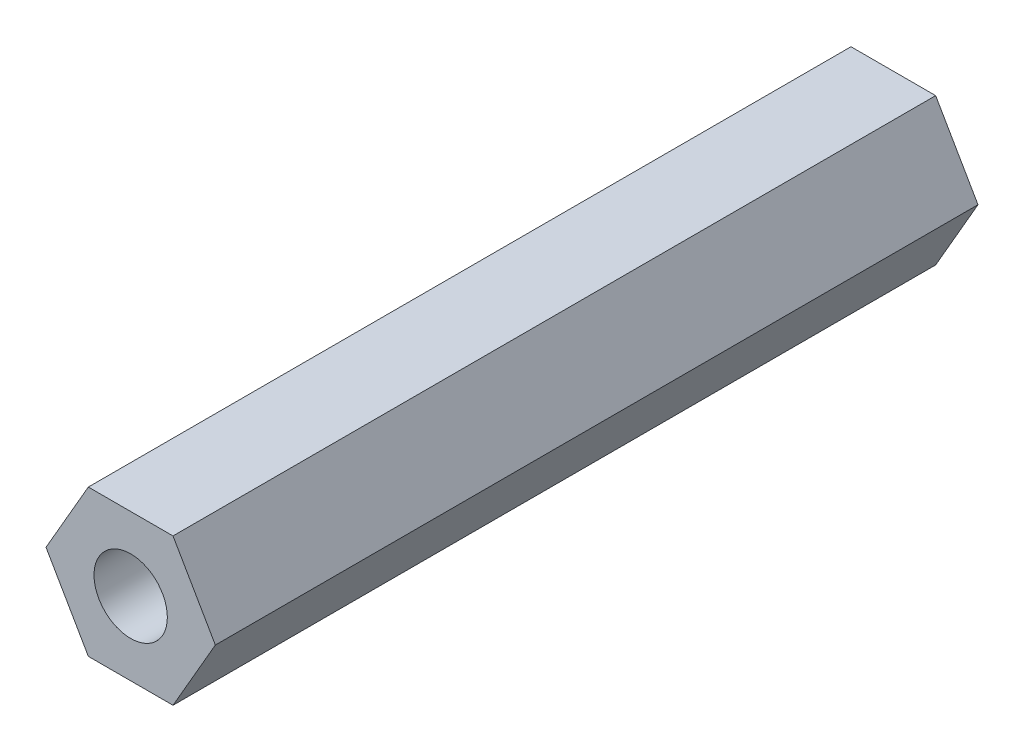
ISO-10303-21;
HEADER;
FILE_DESCRIPTION(('STEP AP214'),'2;1');
FILE_NAME('part.step','',(''),(''),'','','');
FILE_SCHEMA(('AUTOMOTIVE_DESIGN { 1 0 10303 214 1 1 1 1 }'));
ENDSEC;
DATA;
#1=APPLICATION_CONTEXT('core data for automotive mechanical design processes');
#2=APPLICATION_PROTOCOL_DEFINITION('international standard','automotive_design',2000,#1);
#3=PRODUCT_CONTEXT('',#1,'mechanical');
#4=PRODUCT('Part','Part','',(#3));
#5=PRODUCT_RELATED_PRODUCT_CATEGORY('part','',(#4));
#6=PRODUCT_DEFINITION_FORMATION('','',#4);
#7=PRODUCT_DEFINITION_CONTEXT('part definition',#1,'design');
#8=PRODUCT_DEFINITION('design','',#6,#7);
#9=PRODUCT_DEFINITION_SHAPE('','',#8);
#10=(LENGTH_UNIT() NAMED_UNIT(*) SI_UNIT(.MILLI.,.METRE.));
#11=(NAMED_UNIT(*) PLANE_ANGLE_UNIT() SI_UNIT($,.RADIAN.));
#12=(NAMED_UNIT(*) SI_UNIT($,.STERADIAN.) SOLID_ANGLE_UNIT());
#13=UNCERTAINTY_MEASURE_WITH_UNIT(LENGTH_MEASURE(1.E-05),#10,'distance_accuracy_value','');
#14=(GEOMETRIC_REPRESENTATION_CONTEXT(3) GLOBAL_UNCERTAINTY_ASSIGNED_CONTEXT((#13)) GLOBAL_UNIT_ASSIGNED_CONTEXT((#10,
#11,#12)) REPRESENTATION_CONTEXT('',''));
#15=CARTESIAN_POINT('',(0.,0.,0.));
#16=DIRECTION('',(0.,0.,1.));
#17=DIRECTION('',(1.,0.,0.));
#18=AXIS2_PLACEMENT_3D('',#15,#16,#17);
#19=CARTESIAN_POINT('',(0.,0.,66.04));
#20=DIRECTION('',(0.,0.,1.));
#21=DIRECTION('',(1.,0.,0.));
#22=AXIS2_PLACEMENT_3D('',#19,#20,#21);
#23=PLANE('',#22);
#24=DIRECTION('',(0.499999999999995,0.866025403784441,0.));
#25=VECTOR('',#24,1.);
#26=CARTESIAN_POINT('',(3.66617420935418,-6.34999999999993,66.04));
#27=LINE('',#26,#25);
#28=CARTESIAN_POINT('',(3.66617420935418,-6.34999999999993,66.04));
#29=VERTEX_POINT('',#28);
#30=CARTESIAN_POINT('',(7.33234841870821,0.,66.04));
#31=VERTEX_POINT('',#30);
#32=EDGE_CURVE('E152',#29,#31,#27,.T.);
#33=ORIENTED_EDGE('',*,*,#32,.T.);
#34=DIRECTION('',(-0.500000000000001,0.866025403784438,0.));
#35=VECTOR('',#34,1.);
#36=CARTESIAN_POINT('',(7.33234841870821,0.,66.04));
#37=LINE('',#36,#35);
#38=CARTESIAN_POINT('',(3.66617420935409,6.34999999999998,66.04));
#39=VERTEX_POINT('',#38);
#40=EDGE_CURVE('E100',#31,#39,#37,.T.);
#41=ORIENTED_EDGE('',*,*,#40,.T.);
#42=DIRECTION('',(-1.,0.,0.));
#43=VECTOR('',#42,1.);
#44=CARTESIAN_POINT('',(3.66617420935409,6.34999999999998,66.04));
#45=LINE('',#44,#43);
#46=CARTESIAN_POINT('',(-3.66617420935413,6.34999999999995,66.04));
#47=VERTEX_POINT('',#46);
#48=EDGE_CURVE('E113',#39,#47,#45,.T.);
#49=ORIENTED_EDGE('',*,*,#48,.T.);
#50=DIRECTION('',(-0.499999999999995,-0.866025403784442,0.));
#51=VECTOR('',#50,1.);
#52=CARTESIAN_POINT('',(-3.66617420935413,6.34999999999995,66.04));
#53=LINE('',#52,#51);
#54=CARTESIAN_POINT('',(-7.33234841870821,0.,66.04));
#55=VERTEX_POINT('',#54);
#56=EDGE_CURVE('E107',#47,#55,#53,.T.);
#57=ORIENTED_EDGE('',*,*,#56,.T.);
#58=DIRECTION('',(0.500000000000007,-0.866025403784434,0.));
#59=VECTOR('',#58,1.);
#60=CARTESIAN_POINT('',(-7.33234841870821,0.,66.04));
#61=LINE('',#60,#59);
#62=CARTESIAN_POINT('',(-3.66617420935405,-6.35,66.04));
#63=VERTEX_POINT('',#62);
#64=EDGE_CURVE('E111',#55,#63,#61,.T.);
#65=ORIENTED_EDGE('',*,*,#64,.T.);
#66=DIRECTION('',(1.,0.,0.));
#67=VECTOR('',#66,1.);
#68=CARTESIAN_POINT('',(-3.66617420935405,-6.35,66.04));
#69=LINE('',#68,#67);
#70=EDGE_CURVE('E63',#63,#29,#69,.T.);
#71=ORIENTED_EDGE('',*,*,#70,.T.);
#72=EDGE_LOOP('',(#33,#41,#49,#57,#65,#71));
#73=FACE_BOUND('',#72,.T.);
#74=CARTESIAN_POINT('',(0.,0.,66.04));
#75=DIRECTION('',(0.,0.,1.));
#76=DIRECTION('',(1.,0.,0.));
#77=AXIS2_PLACEMENT_3D('',#74,#75,#76);
#78=CIRCLE('',#77,3.175);
#79=CARTESIAN_POINT('',(3.175,0.,66.04));
#80=VERTEX_POINT('',#79);
#81=EDGE_CURVE('E140',#80,#80,#78,.T.);
#82=ORIENTED_EDGE('',*,*,#81,.F.);
#83=EDGE_LOOP('',(#82));
#84=FACE_BOUND('',#83,.T.);
#85=ADVANCED_FACE('F45',(#73,#84),#23,.T.);
#86=CARTESIAN_POINT('',(0.,0.,0.));
#87=DIRECTION('',(0.,0.,1.));
#88=DIRECTION('',(1.,0.,0.));
#89=AXIS2_PLACEMENT_3D('',#86,#87,#88);
#90=PLANE('',#89);
#91=DIRECTION('',(0.499999999999995,0.866025403784441,0.));
#92=VECTOR('',#91,1.);
#93=CARTESIAN_POINT('',(3.66617420935418,-6.34999999999993,0.));
#94=LINE('',#93,#92);
#95=CARTESIAN_POINT('',(3.66617420935418,-6.34999999999993,0.));
#96=VERTEX_POINT('',#95);
#97=CARTESIAN_POINT('',(7.33234841870821,0.,0.));
#98=VERTEX_POINT('',#97);
#99=EDGE_CURVE('E135',#96,#98,#94,.T.);
#100=ORIENTED_EDGE('',*,*,#99,.F.);
#101=DIRECTION('',(1.,0.,0.));
#102=VECTOR('',#101,1.);
#103=CARTESIAN_POINT('',(-3.66617420935405,-6.35,0.));
#104=LINE('',#103,#102);
#105=CARTESIAN_POINT('',(-3.66617420935405,-6.35,0.));
#106=VERTEX_POINT('',#105);
#107=EDGE_CURVE('E92',#106,#96,#104,.T.);
#108=ORIENTED_EDGE('',*,*,#107,.F.);
#109=DIRECTION('',(0.500000000000007,-0.866025403784434,0.));
#110=VECTOR('',#109,1.);
#111=CARTESIAN_POINT('',(-7.33234841870821,0.,0.));
#112=LINE('',#111,#110);
#113=CARTESIAN_POINT('',(-7.33234841870821,0.,0.));
#114=VERTEX_POINT('',#113);
#115=EDGE_CURVE('E86',#114,#106,#112,.T.);
#116=ORIENTED_EDGE('',*,*,#115,.F.);
#117=DIRECTION('',(-0.499999999999995,-0.866025403784442,0.));
#118=VECTOR('',#117,1.);
#119=CARTESIAN_POINT('',(-3.66617420935413,6.34999999999995,0.));
#120=LINE('',#119,#118);
#121=CARTESIAN_POINT('',(-3.66617420935413,6.34999999999995,0.));
#122=VERTEX_POINT('',#121);
#123=EDGE_CURVE('E122',#122,#114,#120,.T.);
#124=ORIENTED_EDGE('',*,*,#123,.F.);
#125=DIRECTION('',(-1.,0.,0.));
#126=VECTOR('',#125,1.);
#127=CARTESIAN_POINT('',(3.66617420935409,6.34999999999998,0.));
#128=LINE('',#127,#126);
#129=CARTESIAN_POINT('',(3.66617420935409,6.34999999999998,0.));
#130=VERTEX_POINT('',#129);
#131=EDGE_CURVE('E143',#130,#122,#128,.T.);
#132=ORIENTED_EDGE('',*,*,#131,.F.);
#133=DIRECTION('',(-0.500000000000001,0.866025403784438,0.));
#134=VECTOR('',#133,1.);
#135=CARTESIAN_POINT('',(7.33234841870821,0.,0.));
#136=LINE('',#135,#134);
#137=EDGE_CURVE('E139',#98,#130,#136,.T.);
#138=ORIENTED_EDGE('',*,*,#137,.F.);
#139=EDGE_LOOP('',(#100,#108,#116,#124,#132,#138));
#140=FACE_BOUND('',#139,.T.);
#141=CARTESIAN_POINT('',(0.,0.,0.));
#142=DIRECTION('',(0.,0.,1.));
#143=DIRECTION('',(1.,0.,0.));
#144=AXIS2_PLACEMENT_3D('',#141,#142,#143);
#145=CIRCLE('',#144,3.175);
#146=CARTESIAN_POINT('',(3.175,0.,0.));
#147=VERTEX_POINT('',#146);
#148=EDGE_CURVE('E249',#147,#147,#145,.T.);
#149=ORIENTED_EDGE('',*,*,#148,.T.);
#150=EDGE_LOOP('',(#149));
#151=FACE_BOUND('',#150,.T.);
#152=ADVANCED_FACE('F165',(#140,#151),#90,.F.);
#153=CARTESIAN_POINT('',(3.66617420935418,-6.34999999999993,66.04));
#154=DIRECTION('',(-0.866025403784442,0.499999999999995,0.));
#155=DIRECTION('',(-0.499999999999995,-0.866025403784442,0.));
#156=AXIS2_PLACEMENT_3D('',#153,#154,#155);
#157=PLANE('',#156);
#158=ORIENTED_EDGE('',*,*,#99,.T.);
#159=DIRECTION('',(0.,0.,-1.));
#160=VECTOR('',#159,1.);
#161=CARTESIAN_POINT('',(7.33234841870821,0.,66.04));
#162=LINE('',#161,#160);
#163=EDGE_CURVE('E11',#31,#98,#162,.T.);
#164=ORIENTED_EDGE('',*,*,#163,.F.);
#165=ORIENTED_EDGE('',*,*,#32,.F.);
#166=DIRECTION('',(0.,0.,-1.));
#167=VECTOR('',#166,1.);
#168=CARTESIAN_POINT('',(3.66617420935418,-6.34999999999993,66.04));
#169=LINE('',#168,#167);
#170=EDGE_CURVE('E131',#29,#96,#169,.T.);
#171=ORIENTED_EDGE('',*,*,#170,.T.);
#172=EDGE_LOOP('',(#158,#164,#165,#171));
#173=FACE_BOUND('',#172,.T.);
#174=ADVANCED_FACE('F47',(#173),#157,.F.);
#175=CARTESIAN_POINT('',(7.33234841870821,0.,66.04));
#176=DIRECTION('',(-0.866025403784438,-0.500000000000001,0.));
#177=DIRECTION('',(0.500000000000001,-0.866025403784438,0.));
#178=AXIS2_PLACEMENT_3D('',#175,#176,#177);
#179=PLANE('',#178);
#180=ORIENTED_EDGE('',*,*,#137,.T.);
#181=DIRECTION('',(0.,0.,-1.));
#182=VECTOR('',#181,1.);
#183=CARTESIAN_POINT('',(3.66617420935409,6.34999999999998,66.04));
#184=LINE('',#183,#182);
#185=EDGE_CURVE('E55',#39,#130,#184,.T.);
#186=ORIENTED_EDGE('',*,*,#185,.F.);
#187=ORIENTED_EDGE('',*,*,#40,.F.);
#188=ORIENTED_EDGE('',*,*,#163,.T.);
#189=EDGE_LOOP('',(#180,#186,#187,#188));
#190=FACE_BOUND('',#189,.T.);
#191=ADVANCED_FACE('F190',(#190),#179,.F.);
#192=CARTESIAN_POINT('',(3.66617420935409,6.34999999999998,66.04));
#193=DIRECTION('',(0.,-1.,0.));
#194=DIRECTION('',(1.,0.,0.));
#195=AXIS2_PLACEMENT_3D('',#192,#193,#194);
#196=PLANE('',#195);
#197=ORIENTED_EDGE('',*,*,#131,.T.);
#198=DIRECTION('',(0.,0.,-1.));
#199=VECTOR('',#198,1.);
#200=CARTESIAN_POINT('',(-3.66617420935413,6.34999999999995,66.04));
#201=LINE('',#200,#199);
#202=EDGE_CURVE('E124',#47,#122,#201,.T.);
#203=ORIENTED_EDGE('',*,*,#202,.F.);
#204=ORIENTED_EDGE('',*,*,#48,.F.);
#205=ORIENTED_EDGE('',*,*,#185,.T.);
#206=EDGE_LOOP('',(#197,#203,#204,#205));
#207=FACE_BOUND('',#206,.T.);
#208=ADVANCED_FACE('F162',(#207),#196,.F.);
#209=CARTESIAN_POINT('',(-3.66617420935413,6.34999999999995,66.04));
#210=DIRECTION('',(0.866025403784442,-0.499999999999995,0.));
#211=DIRECTION('',(0.499999999999995,0.866025403784442,0.));
#212=AXIS2_PLACEMENT_3D('',#209,#210,#211);
#213=PLANE('',#212);
#214=ORIENTED_EDGE('',*,*,#123,.T.);
#215=DIRECTION('',(0.,0.,-1.));
#216=VECTOR('',#215,1.);
#217=CARTESIAN_POINT('',(-7.33234841870821,0.,66.04));
#218=LINE('',#217,#216);
#219=EDGE_CURVE('E119',#55,#114,#218,.T.);
#220=ORIENTED_EDGE('',*,*,#219,.F.);
#221=ORIENTED_EDGE('',*,*,#56,.F.);
#222=ORIENTED_EDGE('',*,*,#202,.T.);
#223=EDGE_LOOP('',(#214,#220,#221,#222));
#224=FACE_BOUND('',#223,.T.);
#225=ADVANCED_FACE('F120',(#224),#213,.F.);
#226=CARTESIAN_POINT('',(-7.33234841870821,0.,66.04));
#227=DIRECTION('',(0.866025403784435,0.500000000000007,0.));
#228=DIRECTION('',(-0.500000000000007,0.866025403784435,0.));
#229=AXIS2_PLACEMENT_3D('',#226,#227,#228);
#230=PLANE('',#229);
#231=ORIENTED_EDGE('',*,*,#115,.T.);
#232=DIRECTION('',(0.,0.,-1.));
#233=VECTOR('',#232,1.);
#234=CARTESIAN_POINT('',(-3.66617420935405,-6.35,66.04));
#235=LINE('',#234,#233);
#236=EDGE_CURVE('E125',#63,#106,#235,.T.);
#237=ORIENTED_EDGE('',*,*,#236,.F.);
#238=ORIENTED_EDGE('',*,*,#64,.F.);
#239=ORIENTED_EDGE('',*,*,#219,.T.);
#240=EDGE_LOOP('',(#231,#237,#238,#239));
#241=FACE_BOUND('',#240,.T.);
#242=ADVANCED_FACE('F127',(#241),#230,.F.);
#243=CARTESIAN_POINT('',(-3.66617420935405,-6.35,66.04));
#244=DIRECTION('',(0.,1.,0.));
#245=DIRECTION('',(-1.,0.,0.));
#246=AXIS2_PLACEMENT_3D('',#243,#244,#245);
#247=PLANE('',#246);
#248=ORIENTED_EDGE('',*,*,#107,.T.);
#249=ORIENTED_EDGE('',*,*,#170,.F.);
#250=ORIENTED_EDGE('',*,*,#70,.F.);
#251=ORIENTED_EDGE('',*,*,#236,.T.);
#252=EDGE_LOOP('',(#248,#249,#250,#251));
#253=FACE_BOUND('',#252,.T.);
#254=ADVANCED_FACE('F170',(#253),#247,.F.);
#255=CARTESIAN_POINT('',(0.,0.,66.04));
#256=DIRECTION('',(0.,0.,-1.));
#257=DIRECTION('',(-1.,0.,0.));
#258=AXIS2_PLACEMENT_3D('',#255,#256,#257);
#259=CYLINDRICAL_SURFACE('',#258,3.175);
#260=ORIENTED_EDGE('',*,*,#81,.T.);
#261=EDGE_LOOP('',(#260));
#262=FACE_BOUND('',#261,.T.);
#263=ORIENTED_EDGE('',*,*,#148,.F.);
#264=EDGE_LOOP('',(#263));
#265=FACE_BOUND('',#264,.T.);
#266=ADVANCED_FACE('F172',(#262,#265),#259,.F.);
#267=CLOSED_SHELL('',(#85,#152,#174,#191,#208,#225,#242,#254,#266));
#268=MANIFOLD_SOLID_BREP('B2',#267);
#269=ADVANCED_BREP_SHAPE_REPRESENTATION('',(#18,#268),#14);
#270=SHAPE_DEFINITION_REPRESENTATION(#9,#269);
ENDSEC;
END-ISO-10303-21;
